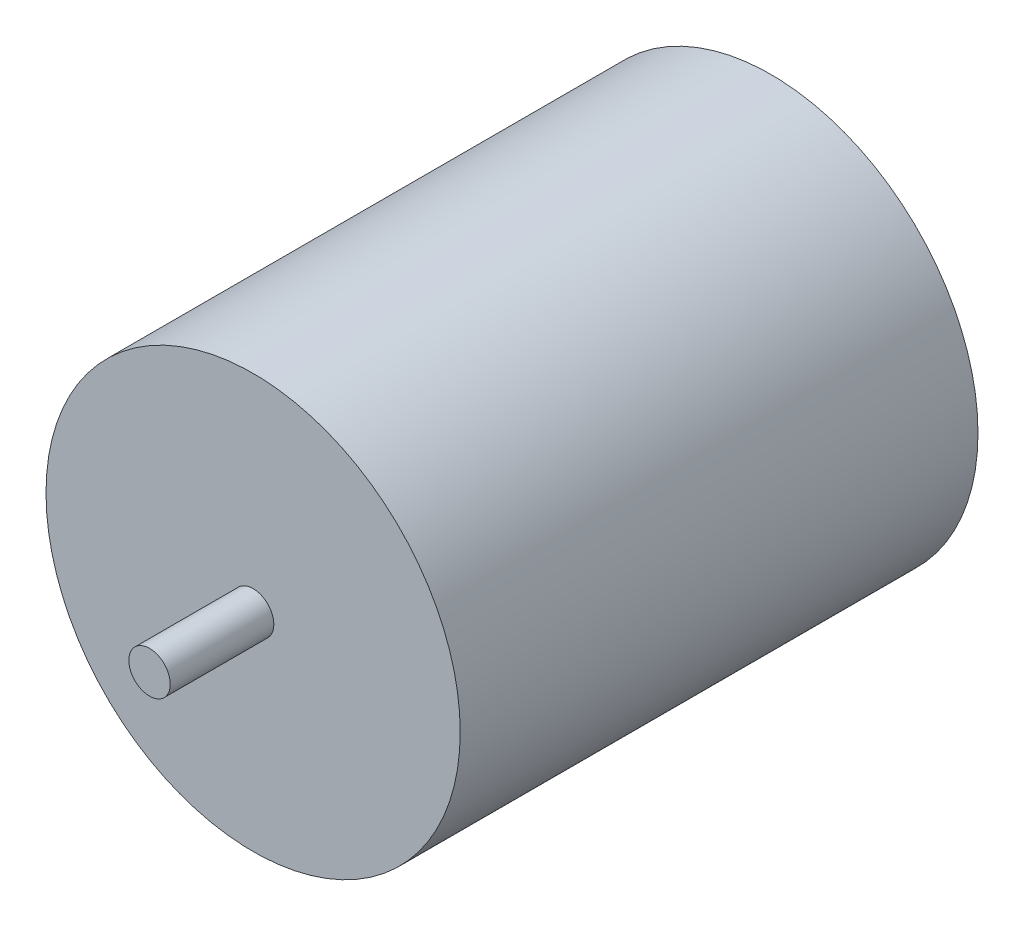
ISO-10303-21;
HEADER;
FILE_DESCRIPTION(('STEP AP214'),'2;1');
FILE_NAME('part.step','',(''),(''),'','','');
FILE_SCHEMA(('AUTOMOTIVE_DESIGN { 1 0 10303 214 1 1 1 1 }'));
ENDSEC;
DATA;
#1=APPLICATION_CONTEXT('core data for automotive mechanical design processes');
#2=APPLICATION_PROTOCOL_DEFINITION('international standard','automotive_design',2000,#1);
#3=PRODUCT_CONTEXT('',#1,'mechanical');
#4=PRODUCT('Part','Part','',(#3));
#5=PRODUCT_RELATED_PRODUCT_CATEGORY('part','',(#4));
#6=PRODUCT_DEFINITION_FORMATION('','',#4);
#7=PRODUCT_DEFINITION_CONTEXT('part definition',#1,'design');
#8=PRODUCT_DEFINITION('design','',#6,#7);
#9=PRODUCT_DEFINITION_SHAPE('','',#8);
#10=(LENGTH_UNIT() NAMED_UNIT(*) SI_UNIT(.MILLI.,.METRE.));
#11=(NAMED_UNIT(*) PLANE_ANGLE_UNIT() SI_UNIT($,.RADIAN.));
#12=(NAMED_UNIT(*) SI_UNIT($,.STERADIAN.) SOLID_ANGLE_UNIT());
#13=UNCERTAINTY_MEASURE_WITH_UNIT(LENGTH_MEASURE(1.E-05),#10,'distance_accuracy_value','');
#14=(GEOMETRIC_REPRESENTATION_CONTEXT(3) GLOBAL_UNCERTAINTY_ASSIGNED_CONTEXT((#13)) GLOBAL_UNIT_ASSIGNED_CONTEXT((#10,
#11,#12)) REPRESENTATION_CONTEXT('',''));
#15=CARTESIAN_POINT('',(0.,0.,0.));
#16=DIRECTION('',(0.,0.,1.));
#17=DIRECTION('',(1.,0.,0.));
#18=AXIS2_PLACEMENT_3D('',#15,#16,#17);
#19=CARTESIAN_POINT('',(0.,0.,31.75));
#20=DIRECTION('',(0.,0.,-1.));
#21=DIRECTION('',(-1.,0.,0.));
#22=AXIS2_PLACEMENT_3D('',#19,#20,#21);
#23=CYLINDRICAL_SURFACE('',#22,12.7);
#24=CARTESIAN_POINT('',(0.,0.,31.75));
#25=DIRECTION('',(0.,0.,1.));
#26=DIRECTION('',(1.,0.,0.));
#27=AXIS2_PLACEMENT_3D('',#24,#25,#26);
#28=CIRCLE('',#27,12.7);
#29=CARTESIAN_POINT('',(12.7,0.,31.75));
#30=VERTEX_POINT('',#29);
#31=EDGE_CURVE('E10',#30,#30,#28,.T.);
#32=ORIENTED_EDGE('',*,*,#31,.F.);
#33=EDGE_LOOP('',(#32));
#34=FACE_BOUND('',#33,.T.);
#35=CARTESIAN_POINT('',(0.,0.,0.));
#36=DIRECTION('',(0.,0.,1.));
#37=DIRECTION('',(1.,0.,0.));
#38=AXIS2_PLACEMENT_3D('',#35,#36,#37);
#39=CIRCLE('',#38,12.7);
#40=CARTESIAN_POINT('',(12.7,0.,0.));
#41=VERTEX_POINT('',#40);
#42=EDGE_CURVE('E38',#41,#41,#39,.T.);
#43=ORIENTED_EDGE('',*,*,#42,.T.);
#44=EDGE_LOOP('',(#43));
#45=FACE_BOUND('',#44,.T.);
#46=ADVANCED_FACE('F35',(#34,#45),#23,.T.);
#47=CARTESIAN_POINT('',(0.,0.,31.75));
#48=DIRECTION('',(0.,0.,1.));
#49=DIRECTION('',(1.,0.,0.));
#50=AXIS2_PLACEMENT_3D('',#47,#48,#49);
#51=PLANE('',#50);
#52=CARTESIAN_POINT('',(0.,0.,31.75));
#53=DIRECTION('',(0.,0.,1.));
#54=DIRECTION('',(1.,0.,0.));
#55=AXIS2_PLACEMENT_3D('',#52,#53,#54);
#56=CIRCLE('',#55,1.27);
#57=CARTESIAN_POINT('',(1.27,0.,31.75));
#58=VERTEX_POINT('',#57);
#59=EDGE_CURVE('E47',#58,#58,#56,.T.);
#60=ORIENTED_EDGE('',*,*,#59,.F.);
#61=EDGE_LOOP('',(#60));
#62=FACE_BOUND('',#61,.T.);
#63=ORIENTED_EDGE('',*,*,#31,.T.);
#64=EDGE_LOOP('',(#63));
#65=FACE_BOUND('',#64,.T.);
#66=ADVANCED_FACE('F62',(#62,#65),#51,.T.);
#67=CARTESIAN_POINT('',(0.,0.,0.));
#68=DIRECTION('',(0.,0.,1.));
#69=DIRECTION('',(1.,0.,0.));
#70=AXIS2_PLACEMENT_3D('',#67,#68,#69);
#71=PLANE('',#70);
#72=ORIENTED_EDGE('',*,*,#42,.F.);
#73=EDGE_LOOP('',(#72));
#74=FACE_BOUND('',#73,.T.);
#75=ADVANCED_FACE('F58',(#74),#71,.F.);
#76=CARTESIAN_POINT('',(0.,0.,38.1));
#77=DIRECTION('',(0.,0.,-1.));
#78=DIRECTION('',(-1.,0.,0.));
#79=AXIS2_PLACEMENT_3D('',#76,#77,#78);
#80=CYLINDRICAL_SURFACE('',#79,1.27);
#81=CARTESIAN_POINT('',(0.,0.,38.1));
#82=DIRECTION('',(0.,0.,1.));
#83=DIRECTION('',(1.,0.,0.));
#84=AXIS2_PLACEMENT_3D('',#81,#82,#83);
#85=CIRCLE('',#84,1.27);
#86=CARTESIAN_POINT('',(1.27,0.,38.1));
#87=VERTEX_POINT('',#86);
#88=EDGE_CURVE('E45',#87,#87,#85,.T.);
#89=ORIENTED_EDGE('',*,*,#88,.F.);
#90=EDGE_LOOP('',(#89));
#91=FACE_BOUND('',#90,.T.);
#92=ORIENTED_EDGE('',*,*,#59,.T.);
#93=EDGE_LOOP('',(#92));
#94=FACE_BOUND('',#93,.T.);
#95=ADVANCED_FACE('F55',(#91,#94),#80,.T.);
#96=CARTESIAN_POINT('',(0.,0.,38.1));
#97=DIRECTION('',(0.,0.,1.));
#98=DIRECTION('',(1.,0.,0.));
#99=AXIS2_PLACEMENT_3D('',#96,#97,#98);
#100=PLANE('',#99);
#101=ORIENTED_EDGE('',*,*,#88,.T.);
#102=EDGE_LOOP('',(#101));
#103=FACE_BOUND('',#102,.T.);
#104=ADVANCED_FACE('F53',(#103),#100,.T.);
#105=CLOSED_SHELL('',(#46,#66,#75,#95,#104));
#106=MANIFOLD_SOLID_BREP('B2',#105);
#107=ADVANCED_BREP_SHAPE_REPRESENTATION('',(#18,#106),#14);
#108=SHAPE_DEFINITION_REPRESENTATION(#9,#107);
ENDSEC;
END-ISO-10303-21;
